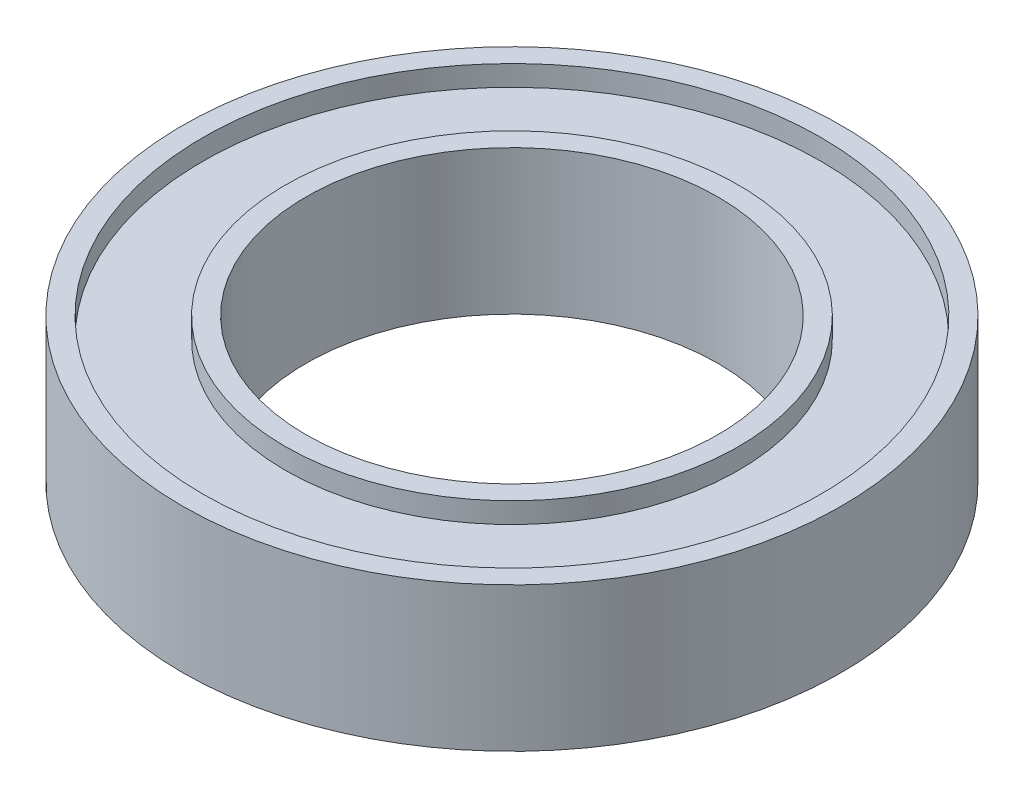
ISO-10303-21;
HEADER;
FILE_DESCRIPTION(('STEP AP214'),'2;1');
FILE_NAME('part.step','',(''),(''),'','','');
FILE_SCHEMA(('AUTOMOTIVE_DESIGN { 1 0 10303 214 1 1 1 1 }'));
ENDSEC;
DATA;
#1=APPLICATION_CONTEXT('core data for automotive mechanical design processes');
#2=APPLICATION_PROTOCOL_DEFINITION('international standard','automotive_design',2000,#1);
#3=PRODUCT_CONTEXT('',#1,'mechanical');
#4=PRODUCT('Part','Part','',(#3));
#5=PRODUCT_RELATED_PRODUCT_CATEGORY('part','',(#4));
#6=PRODUCT_DEFINITION_FORMATION('','',#4);
#7=PRODUCT_DEFINITION_CONTEXT('part definition',#1,'design');
#8=PRODUCT_DEFINITION('design','',#6,#7);
#9=PRODUCT_DEFINITION_SHAPE('','',#8);
#10=(LENGTH_UNIT() NAMED_UNIT(*) SI_UNIT(.MILLI.,.METRE.));
#11=(NAMED_UNIT(*) PLANE_ANGLE_UNIT() SI_UNIT($,.RADIAN.));
#12=(NAMED_UNIT(*) SI_UNIT($,.STERADIAN.) SOLID_ANGLE_UNIT());
#13=UNCERTAINTY_MEASURE_WITH_UNIT(LENGTH_MEASURE(1.E-05),#10,'distance_accuracy_value','');
#14=(GEOMETRIC_REPRESENTATION_CONTEXT(3) GLOBAL_UNCERTAINTY_ASSIGNED_CONTEXT((#13)) GLOBAL_UNIT_ASSIGNED_CONTEXT((#10,
#11,#12)) REPRESENTATION_CONTEXT('',''));
#15=CARTESIAN_POINT('',(0.,0.,0.));
#16=DIRECTION('',(0.,0.,1.));
#17=DIRECTION('',(1.,0.,0.));
#18=AXIS2_PLACEMENT_3D('',#15,#16,#17);
#19=CARTESIAN_POINT('',(0.,0.,0.));
#20=DIRECTION('',(0.,1.,0.));
#21=DIRECTION('',(0.,0.,1.));
#22=AXIS2_PLACEMENT_3D('',#19,#20,#21);
#23=PLANE('',#22);
#24=CARTESIAN_POINT('',(0.,0.,0.));
#25=DIRECTION('',(0.,1.,0.));
#26=DIRECTION('',(0.,0.,1.));
#27=AXIS2_PLACEMENT_3D('',#24,#25,#26);
#28=CIRCLE('',#27,10.);
#29=CARTESIAN_POINT('',(0.,0.,10.));
#30=VERTEX_POINT('',#29);
#31=EDGE_CURVE('E43',#30,#30,#28,.T.);
#32=ORIENTED_EDGE('',*,*,#31,.T.);
#33=EDGE_LOOP('',(#32));
#34=FACE_BOUND('',#33,.T.);
#35=CARTESIAN_POINT('',(0.,0.,0.));
#36=DIRECTION('',(0.,-1.,0.));
#37=DIRECTION('',(0.,0.,-1.));
#38=AXIS2_PLACEMENT_3D('',#35,#36,#37);
#39=CIRCLE('',#38,11.);
#40=CARTESIAN_POINT('',(0.,0.,-11.));
#41=VERTEX_POINT('',#40);
#42=EDGE_CURVE('E67',#41,#41,#39,.T.);
#43=ORIENTED_EDGE('',*,*,#42,.T.);
#44=EDGE_LOOP('',(#43));
#45=FACE_BOUND('',#44,.T.);
#46=ADVANCED_FACE('F30',(#34,#45),#23,.F.);
#47=CARTESIAN_POINT('',(0.,7.,0.));
#48=DIRECTION('',(0.,1.,0.));
#49=DIRECTION('',(0.,0.,1.));
#50=AXIS2_PLACEMENT_3D('',#47,#48,#49);
#51=PLANE('',#50);
#52=CARTESIAN_POINT('',(0.,7.,0.));
#53=DIRECTION('',(0.,1.,0.));
#54=DIRECTION('',(0.,0.,1.));
#55=AXIS2_PLACEMENT_3D('',#52,#53,#54);
#56=CIRCLE('',#55,10.);
#57=CARTESIAN_POINT('',(0.,7.,10.));
#58=VERTEX_POINT('',#57);
#59=EDGE_CURVE('E41',#58,#58,#56,.T.);
#60=ORIENTED_EDGE('',*,*,#59,.F.);
#61=EDGE_LOOP('',(#60));
#62=FACE_BOUND('',#61,.T.);
#63=CARTESIAN_POINT('',(0.,7.,0.));
#64=DIRECTION('',(0.,1.,0.));
#65=DIRECTION('',(0.,0.,1.));
#66=AXIS2_PLACEMENT_3D('',#63,#64,#65);
#67=CIRCLE('',#66,11.);
#68=CARTESIAN_POINT('',(0.,7.,11.));
#69=VERTEX_POINT('',#68);
#70=EDGE_CURVE('E55',#69,#69,#67,.T.);
#71=ORIENTED_EDGE('',*,*,#70,.T.);
#72=EDGE_LOOP('',(#71));
#73=FACE_BOUND('',#72,.T.);
#74=ADVANCED_FACE('F105',(#62,#73),#51,.T.);
#75=CARTESIAN_POINT('',(0.,7.,0.));
#76=DIRECTION('',(0.,1.,0.));
#77=DIRECTION('',(0.,0.,1.));
#78=AXIS2_PLACEMENT_3D('',#75,#76,#77);
#79=CIRCLE('',#78,15.);
#80=CARTESIAN_POINT('',(0.,7.,15.));
#81=VERTEX_POINT('',#80);
#82=EDGE_CURVE('E49',#81,#81,#79,.T.);
#83=ORIENTED_EDGE('',*,*,#82,.F.);
#84=EDGE_LOOP('',(#83));
#85=FACE_BOUND('',#84,.T.);
#86=CARTESIAN_POINT('',(0.,7.,0.));
#87=DIRECTION('',(0.,1.,0.));
#88=DIRECTION('',(0.,0.,1.));
#89=AXIS2_PLACEMENT_3D('',#86,#87,#88);
#90=CIRCLE('',#89,16.);
#91=CARTESIAN_POINT('',(0.,7.,16.));
#92=VERTEX_POINT('',#91);
#93=EDGE_CURVE('E10',#92,#92,#90,.T.);
#94=ORIENTED_EDGE('',*,*,#93,.T.);
#95=EDGE_LOOP('',(#94));
#96=FACE_BOUND('',#95,.T.);
#97=ADVANCED_FACE('F92',(#85,#96),#51,.T.);
#98=CARTESIAN_POINT('',(0.,0.,0.));
#99=DIRECTION('',(0.,-1.,0.));
#100=DIRECTION('',(0.,0.,-1.));
#101=AXIS2_PLACEMENT_3D('',#98,#99,#100);
#102=CIRCLE('',#101,15.);
#103=CARTESIAN_POINT('',(0.,0.,-15.));
#104=VERTEX_POINT('',#103);
#105=EDGE_CURVE('E61',#104,#104,#102,.T.);
#106=ORIENTED_EDGE('',*,*,#105,.F.);
#107=EDGE_LOOP('',(#106));
#108=FACE_BOUND('',#107,.T.);
#109=CARTESIAN_POINT('',(0.,0.,0.));
#110=DIRECTION('',(0.,1.,0.));
#111=DIRECTION('',(0.,0.,1.));
#112=AXIS2_PLACEMENT_3D('',#109,#110,#111);
#113=CIRCLE('',#112,16.);
#114=CARTESIAN_POINT('',(0.,0.,16.));
#115=VERTEX_POINT('',#114);
#116=EDGE_CURVE('E34',#115,#115,#113,.T.);
#117=ORIENTED_EDGE('',*,*,#116,.F.);
#118=EDGE_LOOP('',(#117));
#119=FACE_BOUND('',#118,.T.);
#120=ADVANCED_FACE('F89',(#108,#119),#23,.F.);
#121=CARTESIAN_POINT('',(0.,7.,0.));
#122=DIRECTION('',(0.,-1.,0.));
#123=DIRECTION('',(0.,0.,-1.));
#124=AXIS2_PLACEMENT_3D('',#121,#122,#123);
#125=CYLINDRICAL_SURFACE('',#124,16.);
#126=ORIENTED_EDGE('',*,*,#93,.F.);
#127=EDGE_LOOP('',(#126));
#128=FACE_BOUND('',#127,.T.);
#129=ORIENTED_EDGE('',*,*,#116,.T.);
#130=EDGE_LOOP('',(#129));
#131=FACE_BOUND('',#130,.T.);
#132=ADVANCED_FACE('F32',(#128,#131),#125,.T.);
#133=CARTESIAN_POINT('',(0.,7.,0.));
#134=DIRECTION('',(0.,-1.,0.));
#135=DIRECTION('',(0.,0.,-1.));
#136=AXIS2_PLACEMENT_3D('',#133,#134,#135);
#137=CYLINDRICAL_SURFACE('',#136,10.);
#138=ORIENTED_EDGE('',*,*,#59,.T.);
#139=EDGE_LOOP('',(#138));
#140=FACE_BOUND('',#139,.T.);
#141=ORIENTED_EDGE('',*,*,#31,.F.);
#142=EDGE_LOOP('',(#141));
#143=FACE_BOUND('',#142,.T.);
#144=ADVANCED_FACE('F96',(#140,#143),#137,.F.);
#145=CARTESIAN_POINT('',(0.,6.,0.));
#146=DIRECTION('',(0.,1.,0.));
#147=DIRECTION('',(0.,0.,1.));
#148=AXIS2_PLACEMENT_3D('',#145,#146,#147);
#149=CYLINDRICAL_SURFACE('',#148,15.);
#150=CARTESIAN_POINT('',(0.,6.,0.));
#151=DIRECTION('',(0.,1.,0.));
#152=DIRECTION('',(0.,0.,1.));
#153=AXIS2_PLACEMENT_3D('',#150,#151,#152);
#154=CIRCLE('',#153,15.);
#155=CARTESIAN_POINT('',(0.,6.,15.));
#156=VERTEX_POINT('',#155);
#157=EDGE_CURVE('E46',#156,#156,#154,.T.);
#158=ORIENTED_EDGE('',*,*,#157,.F.);
#159=EDGE_LOOP('',(#158));
#160=FACE_BOUND('',#159,.T.);
#161=ORIENTED_EDGE('',*,*,#82,.T.);
#162=EDGE_LOOP('',(#161));
#163=FACE_BOUND('',#162,.T.);
#164=ADVANCED_FACE('F101',(#160,#163),#149,.F.);
#165=CARTESIAN_POINT('',(0.,6.,0.));
#166=DIRECTION('',(0.,1.,0.));
#167=DIRECTION('',(0.,0.,1.));
#168=AXIS2_PLACEMENT_3D('',#165,#166,#167);
#169=PLANE('',#168);
#170=CARTESIAN_POINT('',(0.,6.,0.));
#171=DIRECTION('',(0.,1.,0.));
#172=DIRECTION('',(0.,0.,1.));
#173=AXIS2_PLACEMENT_3D('',#170,#171,#172);
#174=CIRCLE('',#173,11.);
#175=CARTESIAN_POINT('',(0.,6.,11.));
#176=VERTEX_POINT('',#175);
#177=EDGE_CURVE('E52',#176,#176,#174,.T.);
#178=ORIENTED_EDGE('',*,*,#177,.F.);
#179=EDGE_LOOP('',(#178));
#180=FACE_BOUND('',#179,.T.);
#181=ORIENTED_EDGE('',*,*,#157,.T.);
#182=EDGE_LOOP('',(#181));
#183=FACE_BOUND('',#182,.T.);
#184=ADVANCED_FACE('F118',(#180,#183),#169,.T.);
#185=CARTESIAN_POINT('',(0.,6.,0.));
#186=DIRECTION('',(0.,1.,0.));
#187=DIRECTION('',(0.,0.,1.));
#188=AXIS2_PLACEMENT_3D('',#185,#186,#187);
#189=CYLINDRICAL_SURFACE('',#188,11.);
#190=ORIENTED_EDGE('',*,*,#177,.T.);
#191=EDGE_LOOP('',(#190));
#192=FACE_BOUND('',#191,.T.);
#193=ORIENTED_EDGE('',*,*,#70,.F.);
#194=EDGE_LOOP('',(#193));
#195=FACE_BOUND('',#194,.T.);
#196=ADVANCED_FACE('F85',(#192,#195),#189,.T.);
#197=CARTESIAN_POINT('',(0.,1.,0.));
#198=DIRECTION('',(0.,-1.,0.));
#199=DIRECTION('',(0.,0.,-1.));
#200=AXIS2_PLACEMENT_3D('',#197,#198,#199);
#201=CYLINDRICAL_SURFACE('',#200,15.);
#202=CARTESIAN_POINT('',(0.,1.,0.));
#203=DIRECTION('',(0.,-1.,0.));
#204=DIRECTION('',(0.,0.,-1.));
#205=AXIS2_PLACEMENT_3D('',#202,#203,#204);
#206=CIRCLE('',#205,15.);
#207=CARTESIAN_POINT('',(0.,1.,-15.));
#208=VERTEX_POINT('',#207);
#209=EDGE_CURVE('E58',#208,#208,#206,.T.);
#210=ORIENTED_EDGE('',*,*,#209,.F.);
#211=EDGE_LOOP('',(#210));
#212=FACE_BOUND('',#211,.T.);
#213=ORIENTED_EDGE('',*,*,#105,.T.);
#214=EDGE_LOOP('',(#213));
#215=FACE_BOUND('',#214,.T.);
#216=ADVANCED_FACE('F79',(#212,#215),#201,.F.);
#217=CARTESIAN_POINT('',(0.,1.,0.));
#218=DIRECTION('',(0.,-1.,0.));
#219=DIRECTION('',(0.,0.,-1.));
#220=AXIS2_PLACEMENT_3D('',#217,#218,#219);
#221=PLANE('',#220);
#222=CARTESIAN_POINT('',(0.,1.,0.));
#223=DIRECTION('',(0.,-1.,0.));
#224=DIRECTION('',(0.,0.,-1.));
#225=AXIS2_PLACEMENT_3D('',#222,#223,#224);
#226=CIRCLE('',#225,11.);
#227=CARTESIAN_POINT('',(0.,1.,-11.));
#228=VERTEX_POINT('',#227);
#229=EDGE_CURVE('E64',#228,#228,#226,.T.);
#230=ORIENTED_EDGE('',*,*,#229,.F.);
#231=EDGE_LOOP('',(#230));
#232=FACE_BOUND('',#231,.T.);
#233=ORIENTED_EDGE('',*,*,#209,.T.);
#234=EDGE_LOOP('',(#233));
#235=FACE_BOUND('',#234,.T.);
#236=ADVANCED_FACE('F76',(#232,#235),#221,.T.);
#237=CARTESIAN_POINT('',(0.,1.,0.));
#238=DIRECTION('',(0.,-1.,0.));
#239=DIRECTION('',(0.,0.,-1.));
#240=AXIS2_PLACEMENT_3D('',#237,#238,#239);
#241=CYLINDRICAL_SURFACE('',#240,11.);
#242=ORIENTED_EDGE('',*,*,#229,.T.);
#243=EDGE_LOOP('',(#242));
#244=FACE_BOUND('',#243,.T.);
#245=ORIENTED_EDGE('',*,*,#42,.F.);
#246=EDGE_LOOP('',(#245));
#247=FACE_BOUND('',#246,.T.);
#248=ADVANCED_FACE('F73',(#244,#247),#241,.T.);
#249=CLOSED_SHELL('',(#46,#74,#97,#120,#132,#144,#164,#184,#196,#216,#236,#248));
#250=MANIFOLD_SOLID_BREP('B2',#249);
#251=ADVANCED_BREP_SHAPE_REPRESENTATION('',(#18,#250),#14);
#252=SHAPE_DEFINITION_REPRESENTATION(#9,#251);
ENDSEC;
END-ISO-10303-21;
